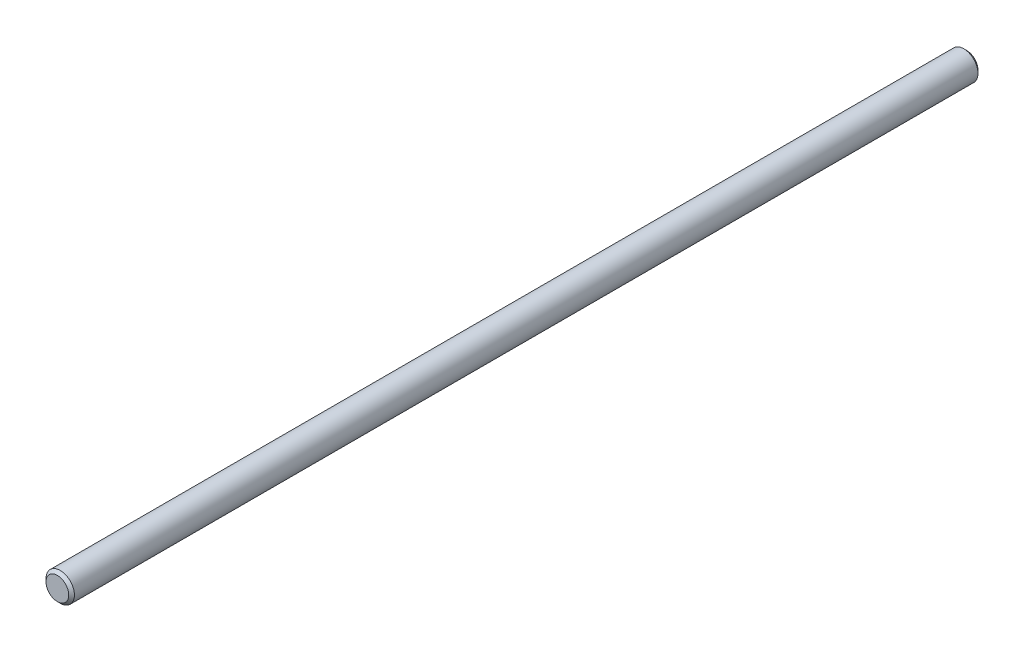
ISO-10303-21;
HEADER;
FILE_DESCRIPTION(('STEP AP214'),'2;1');
FILE_NAME('part.step','',(''),(''),'','','');
FILE_SCHEMA(('AUTOMOTIVE_DESIGN { 1 0 10303 214 1 1 1 1 }'));
ENDSEC;
DATA;
#1=APPLICATION_CONTEXT('core data for automotive mechanical design processes');
#2=APPLICATION_PROTOCOL_DEFINITION('international standard','automotive_design',2000,#1);
#3=PRODUCT_CONTEXT('',#1,'mechanical');
#4=PRODUCT('Part','Part','',(#3));
#5=PRODUCT_RELATED_PRODUCT_CATEGORY('part','',(#4));
#6=PRODUCT_DEFINITION_FORMATION('','',#4);
#7=PRODUCT_DEFINITION_CONTEXT('part definition',#1,'design');
#8=PRODUCT_DEFINITION('design','',#6,#7);
#9=PRODUCT_DEFINITION_SHAPE('','',#8);
#10=(LENGTH_UNIT() NAMED_UNIT(*) SI_UNIT(.MILLI.,.METRE.));
#11=(NAMED_UNIT(*) PLANE_ANGLE_UNIT() SI_UNIT($,.RADIAN.));
#12=(NAMED_UNIT(*) SI_UNIT($,.STERADIAN.) SOLID_ANGLE_UNIT());
#13=UNCERTAINTY_MEASURE_WITH_UNIT(LENGTH_MEASURE(1.E-05),#10,'distance_accuracy_value','');
#14=(GEOMETRIC_REPRESENTATION_CONTEXT(3) GLOBAL_UNCERTAINTY_ASSIGNED_CONTEXT((#13)) GLOBAL_UNIT_ASSIGNED_CONTEXT((#10,
#11,#12)) REPRESENTATION_CONTEXT('',''));
#15=CARTESIAN_POINT('',(0.,0.,0.));
#16=DIRECTION('',(0.,0.,1.));
#17=DIRECTION('',(1.,0.,0.));
#18=AXIS2_PLACEMENT_3D('',#15,#16,#17);
#19=CARTESIAN_POINT('',(0.,0.,304.8));
#20=DIRECTION('',(0.,0.,-1.));
#21=DIRECTION('',(-1.,0.,0.));
#22=AXIS2_PLACEMENT_3D('',#19,#20,#21);
#23=CYLINDRICAL_SURFACE('',#22,9.525);
#24=CARTESIAN_POINT('',(0.,0.,-302.895));
#25=DIRECTION('',(0.,0.,1.));
#26=DIRECTION('',(1.,0.,0.));
#27=AXIS2_PLACEMENT_3D('',#24,#25,#26);
#28=CIRCLE('',#27,9.525);
#29=CARTESIAN_POINT('',(-9.525,0.,-302.895));
#30=VERTEX_POINT('',#29);
#31=EDGE_CURVE('E41',#30,#30,#28,.T.);
#32=CARTESIAN_POINT('',(0.,0.,302.895));
#33=DIRECTION('',(0.,0.,1.));
#34=DIRECTION('',(1.,0.,0.));
#35=AXIS2_PLACEMENT_3D('',#32,#33,#34);
#36=CIRCLE('',#35,9.525);
#37=CARTESIAN_POINT('',(-9.525,0.,302.895));
#38=VERTEX_POINT('',#37);
#39=EDGE_CURVE('E45',#38,#38,#36,.F.);
#40=CARTESIAN_POINT('',(-9.525,0.,-302.895));
#41=CARTESIAN_POINT('',(-9.525,0.,-296.5846875));
#42=CARTESIAN_POINT('',(-9.525,0.,-290.274375));
#43=CARTESIAN_POINT('',(-9.525,0.,-277.65375));
#44=CARTESIAN_POINT('',(-9.525,0.,-271.3434375));
#45=CARTESIAN_POINT('',(-9.525,0.,-258.7228125));
#46=CARTESIAN_POINT('',(-9.525,0.,-252.4125));
#47=CARTESIAN_POINT('',(-9.525,0.,-239.791875));
#48=CARTESIAN_POINT('',(-9.525,0.,-233.4815625));
#49=CARTESIAN_POINT('',(-9.525,0.,-220.8609375));
#50=CARTESIAN_POINT('',(-9.525,0.,-214.550625));
#51=CARTESIAN_POINT('',(-9.525,0.,-201.93));
#52=CARTESIAN_POINT('',(-9.525,0.,-195.6196875));
#53=CARTESIAN_POINT('',(-9.525,0.,-182.9990625));
#54=CARTESIAN_POINT('',(-9.525,0.,-176.68875));
#55=CARTESIAN_POINT('',(-9.525,0.,-164.068125));
#56=CARTESIAN_POINT('',(-9.525,0.,-157.7578125));
#57=CARTESIAN_POINT('',(-9.525,0.,-145.1371875));
#58=CARTESIAN_POINT('',(-9.525,0.,-138.826875));
#59=CARTESIAN_POINT('',(-9.525,0.,-126.20625));
#60=CARTESIAN_POINT('',(-9.525,0.,-119.8959375));
#61=CARTESIAN_POINT('',(-9.525,0.,-107.2753125));
#62=CARTESIAN_POINT('',(-9.525,0.,-100.965));
#63=CARTESIAN_POINT('',(-9.525,0.,-88.3443749999998));
#64=CARTESIAN_POINT('',(-9.525,0.,-82.0340624999998));
#65=CARTESIAN_POINT('',(-9.525,0.,-69.4134374999998));
#66=CARTESIAN_POINT('',(-9.525,0.,-63.1031249999998));
#67=CARTESIAN_POINT('',(-9.525,0.,-50.4824999999998));
#68=CARTESIAN_POINT('',(-9.525,0.,-44.1721874999998));
#69=CARTESIAN_POINT('',(-9.525,0.,-31.5515624999998));
#70=CARTESIAN_POINT('',(-9.525,0.,-25.2412499999998));
#71=CARTESIAN_POINT('',(-9.525,0.,-12.6206249999998));
#72=CARTESIAN_POINT('',(-9.525,0.,-6.31031249999979));
#73=CARTESIAN_POINT('',(-9.525,0.,6.31031250000023));
#74=CARTESIAN_POINT('',(-9.525,0.,12.6206250000002));
#75=CARTESIAN_POINT('',(-9.525,0.,25.2412500000002));
#76=CARTESIAN_POINT('',(-9.525,0.,31.5515625000002));
#77=CARTESIAN_POINT('',(-9.525,0.,44.1721875000002));
#78=CARTESIAN_POINT('',(-9.525,0.,50.4825000000002));
#79=CARTESIAN_POINT('',(-9.525,0.,63.1031250000002));
#80=CARTESIAN_POINT('',(-9.525,0.,69.4134375000002));
#81=CARTESIAN_POINT('',(-9.525,0.,82.0340625000002));
#82=CARTESIAN_POINT('',(-9.525,0.,88.3443750000002));
#83=CARTESIAN_POINT('',(-9.525,0.,100.965));
#84=CARTESIAN_POINT('',(-9.525,0.,107.2753125));
#85=CARTESIAN_POINT('',(-9.525,0.,119.8959375));
#86=CARTESIAN_POINT('',(-9.525,0.,126.20625));
#87=CARTESIAN_POINT('',(-9.525,0.,138.826875));
#88=CARTESIAN_POINT('',(-9.525,0.,145.1371875));
#89=CARTESIAN_POINT('',(-9.525,0.,157.7578125));
#90=CARTESIAN_POINT('',(-9.525,0.,164.068125));
#91=CARTESIAN_POINT('',(-9.525,0.,176.68875));
#92=CARTESIAN_POINT('',(-9.525,0.,182.9990625));
#93=CARTESIAN_POINT('',(-9.525,0.,195.6196875));
#94=CARTESIAN_POINT('',(-9.525,0.,201.93));
#95=CARTESIAN_POINT('',(-9.525,0.,214.550625));
#96=CARTESIAN_POINT('',(-9.525,0.,220.8609375));
#97=CARTESIAN_POINT('',(-9.525,0.,233.4815625));
#98=CARTESIAN_POINT('',(-9.525,0.,239.791875));
#99=CARTESIAN_POINT('',(-9.525,0.,252.4125));
#100=CARTESIAN_POINT('',(-9.525,0.,258.7228125));
#101=CARTESIAN_POINT('',(-9.525,0.,271.3434375));
#102=CARTESIAN_POINT('',(-9.525,0.,277.65375));
#103=CARTESIAN_POINT('',(-9.525,0.,290.274375));
#104=CARTESIAN_POINT('',(-9.525,0.,296.5846875));
#105=CARTESIAN_POINT('',(-9.525,0.,302.895));
#106=B_SPLINE_CURVE_WITH_KNOTS('',3,(#40,#41,#42,#43,#44,#45,#46,#47,#48,#49,#50,#51,#52,#53,
#54,#55,#56,#57,#58,#59,#60,#61,#62,#63,#64,#65,#66,#67,#68,#69,#70,#71,#72,#73,#74,#75,#76,#77,
#78,#79,#80,#81,#82,#83,#84,#85,#86,#87,#88,#89,#90,#91,#92,#93,#94,#95,#96,#97,#98,#99,#100,
#101,#102,#103,#104,#105),.UNSPECIFIED.,.F.,.F.,(4,2,2,2,2,2,2,2,2,2,2,2,2,2,2,2,2,2,2,2,2,2,2,
2,2,2,2,2,2,2,2,2,4),(0.,18.9309375,37.861875,56.7928125,75.72375,94.6546875000001,113.585625,
132.5165625,151.4475,170.3784375,189.309375,208.2403125,227.17125,246.1021875,265.033125,
283.9640625,302.895,321.8259375,340.756875,359.6878125,378.61875,397.5496875,416.480625,
435.4115625,454.3425,473.2734375,492.204375,511.1353125,530.06625,548.9971875,567.928125,
586.8590625,605.79),.UNSPECIFIED.);
#107=EDGE_CURVE('BSEAM30',#30,#38,#106,.T.);
#108=ORIENTED_EDGE('',*,*,#31,.T.);
#109=ORIENTED_EDGE('',*,*,#39,.T.);
#110=ORIENTED_EDGE('',*,*,#107,.T.);
#111=ORIENTED_EDGE('',*,*,#107,.F.);
#112=EDGE_LOOP('',(#108,#110,#109,#111));
#113=FACE_BOUND('',#112,.T.);
#114=ADVANCED_FACE('F30',(#113),#23,.T.);
#115=CARTESIAN_POINT('',(0.,0.,304.8));
#116=DIRECTION('',(0.,0.,1.));
#117=DIRECTION('',(1.,0.,0.));
#118=AXIS2_PLACEMENT_3D('',#115,#116,#117);
#119=PLANE('',#118);
#120=CARTESIAN_POINT('',(0.,0.,304.8));
#121=DIRECTION('',(0.,0.,1.));
#122=DIRECTION('',(1.,0.,0.));
#123=AXIS2_PLACEMENT_3D('',#120,#121,#122);
#124=CIRCLE('',#123,7.62000000000024);
#125=CARTESIAN_POINT('',(7.62000000000024,0.,304.8));
#126=VERTEX_POINT('',#125);
#127=EDGE_CURVE('E10',#126,#126,#124,.T.);
#128=ORIENTED_EDGE('',*,*,#127,.T.);
#129=EDGE_LOOP('',(#128));
#130=FACE_BOUND('',#129,.T.);
#131=ADVANCED_FACE('F61',(#130),#119,.T.);
#132=CARTESIAN_POINT('',(0.,0.,-304.8));
#133=DIRECTION('',(0.,0.,1.));
#134=DIRECTION('',(1.,0.,0.));
#135=AXIS2_PLACEMENT_3D('',#132,#133,#134);
#136=PLANE('',#135);
#137=CARTESIAN_POINT('',(0.,0.,-304.8));
#138=DIRECTION('',(0.,0.,1.));
#139=DIRECTION('',(1.,0.,0.));
#140=AXIS2_PLACEMENT_3D('',#137,#138,#139);
#141=CIRCLE('',#140,7.61999999999957);
#142=CARTESIAN_POINT('',(7.61999999999957,0.,-304.8));
#143=VERTEX_POINT('',#142);
#144=EDGE_CURVE('E37',#143,#143,#141,.F.);
#145=ORIENTED_EDGE('',*,*,#144,.T.);
#146=EDGE_LOOP('',(#145));
#147=FACE_BOUND('',#146,.T.);
#148=ADVANCED_FACE('F58',(#147),#136,.F.);
#149=CARTESIAN_POINT('',(0.,0.,-302.895));
#150=DIRECTION('',(0.,0.,1.));
#151=DIRECTION('',(1.,0.,0.));
#152=AXIS2_PLACEMENT_3D('',#149,#150,#151);
#153=CONICAL_SURFACE('',#152,9.525,0.785398163397462);
#154=ORIENTED_EDGE('',*,*,#144,.F.);
#155=EDGE_LOOP('',(#154));
#156=FACE_BOUND('',#155,.T.);
#157=ORIENTED_EDGE('',*,*,#31,.F.);
#158=EDGE_LOOP('',(#157));
#159=FACE_BOUND('',#158,.T.);
#160=ADVANCED_FACE('F54',(#156,#159),#153,.T.);
#161=CARTESIAN_POINT('',(0.,0.,304.8));
#162=DIRECTION('',(0.,0.,-1.));
#163=DIRECTION('',(-1.,0.,0.));
#164=AXIS2_PLACEMENT_3D('',#161,#162,#163);
#165=CONICAL_SURFACE('',#164,7.62000000000024,0.785398163397447);
#166=ORIENTED_EDGE('',*,*,#39,.F.);
#167=EDGE_LOOP('',(#166));
#168=FACE_BOUND('',#167,.T.);
#169=ORIENTED_EDGE('',*,*,#127,.F.);
#170=EDGE_LOOP('',(#169));
#171=FACE_BOUND('',#170,.T.);
#172=ADVANCED_FACE('F32',(#168,#171),#165,.T.);
#173=CLOSED_SHELL('',(#114,#131,#148,#160,#172));
#174=MANIFOLD_SOLID_BREP('B2',#173);
#175=ADVANCED_BREP_SHAPE_REPRESENTATION('',(#18,#174),#14);
#176=SHAPE_DEFINITION_REPRESENTATION(#9,#175);
ENDSEC;
END-ISO-10303-21;
